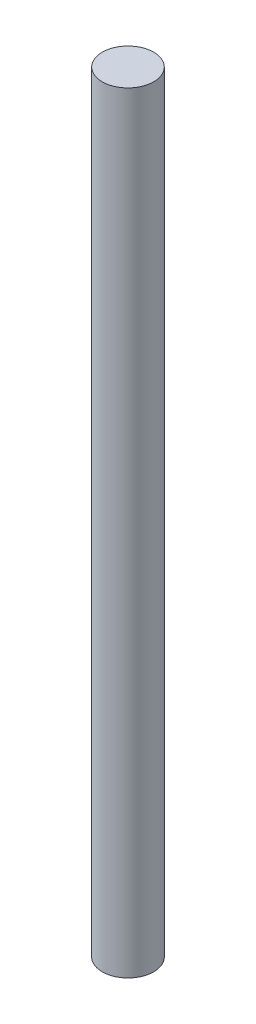
ISO-10303-21;
HEADER;
FILE_DESCRIPTION(('STEP AP214'),'2;1');
FILE_NAME('part.step','',(''),(''),'','','');
FILE_SCHEMA(('AUTOMOTIVE_DESIGN { 1 0 10303 214 1 1 1 1 }'));
ENDSEC;
DATA;
#1=APPLICATION_CONTEXT('core data for automotive mechanical design processes');
#2=APPLICATION_PROTOCOL_DEFINITION('international standard','automotive_design',2000,#1);
#3=PRODUCT_CONTEXT('',#1,'mechanical');
#4=PRODUCT('Part','Part','',(#3));
#5=PRODUCT_RELATED_PRODUCT_CATEGORY('part','',(#4));
#6=PRODUCT_DEFINITION_FORMATION('','',#4);
#7=PRODUCT_DEFINITION_CONTEXT('part definition',#1,'design');
#8=PRODUCT_DEFINITION('design','',#6,#7);
#9=PRODUCT_DEFINITION_SHAPE('','',#8);
#10=(LENGTH_UNIT() NAMED_UNIT(*) SI_UNIT(.MILLI.,.METRE.));
#11=(NAMED_UNIT(*) PLANE_ANGLE_UNIT() SI_UNIT($,.RADIAN.));
#12=(NAMED_UNIT(*) SI_UNIT($,.STERADIAN.) SOLID_ANGLE_UNIT());
#13=UNCERTAINTY_MEASURE_WITH_UNIT(LENGTH_MEASURE(1.E-05),#10,'distance_accuracy_value','');
#14=(GEOMETRIC_REPRESENTATION_CONTEXT(3) GLOBAL_UNCERTAINTY_ASSIGNED_CONTEXT((#13)) GLOBAL_UNIT_ASSIGNED_CONTEXT((#10,
#11,#12)) REPRESENTATION_CONTEXT('',''));
#15=CARTESIAN_POINT('',(0.,0.,0.));
#16=DIRECTION('',(0.,0.,1.));
#17=DIRECTION('',(1.,0.,0.));
#18=AXIS2_PLACEMENT_3D('',#15,#16,#17);
#19=CARTESIAN_POINT('',(0.,150.,0.));
#20=DIRECTION('',(0.,-1.,0.));
#21=DIRECTION('',(0.,0.,-1.));
#22=AXIS2_PLACEMENT_3D('',#19,#20,#21);
#23=CYLINDRICAL_SURFACE('',#22,5.);
#24=CARTESIAN_POINT('',(0.,150.,0.));
#25=DIRECTION('',(0.,1.,0.));
#26=DIRECTION('',(0.,0.,1.));
#27=AXIS2_PLACEMENT_3D('',#24,#25,#26);
#28=CIRCLE('',#27,5.);
#29=CARTESIAN_POINT('',(0.,150.,5.));
#30=VERTEX_POINT('',#29);
#31=EDGE_CURVE('E10',#30,#30,#28,.T.);
#32=ORIENTED_EDGE('',*,*,#31,.F.);
#33=EDGE_LOOP('',(#32));
#34=FACE_BOUND('',#33,.T.);
#35=CARTESIAN_POINT('',(0.,0.,0.));
#36=DIRECTION('',(0.,1.,0.));
#37=DIRECTION('',(0.,0.,1.));
#38=AXIS2_PLACEMENT_3D('',#35,#36,#37);
#39=CIRCLE('',#38,5.);
#40=CARTESIAN_POINT('',(0.,0.,5.));
#41=VERTEX_POINT('',#40);
#42=EDGE_CURVE('E46',#41,#41,#39,.T.);
#43=ORIENTED_EDGE('',*,*,#42,.T.);
#44=EDGE_LOOP('',(#43));
#45=FACE_BOUND('',#44,.T.);
#46=ADVANCED_FACE('F43',(#34,#45),#23,.T.);
#47=CARTESIAN_POINT('',(0.,150.,0.));
#48=DIRECTION('',(0.,1.,0.));
#49=DIRECTION('',(0.,0.,1.));
#50=AXIS2_PLACEMENT_3D('',#47,#48,#49);
#51=PLANE('',#50);
#52=ORIENTED_EDGE('',*,*,#31,.T.);
#53=EDGE_LOOP('',(#52));
#54=FACE_BOUND('',#53,.T.);
#55=ADVANCED_FACE('F58',(#54),#51,.T.);
#56=CARTESIAN_POINT('',(0.,0.,0.));
#57=DIRECTION('',(0.,1.,0.));
#58=DIRECTION('',(0.,0.,1.));
#59=AXIS2_PLACEMENT_3D('',#56,#57,#58);
#60=PLANE('',#59);
#61=ORIENTED_EDGE('',*,*,#42,.F.);
#62=EDGE_LOOP('',(#61));
#63=FACE_BOUND('',#62,.T.);
#64=ADVANCED_FACE('F59',(#63),#60,.F.);
#65=CLOSED_SHELL('',(#46,#55,#64));
#66=MANIFOLD_SOLID_BREP('B2',#65);
#67=ADVANCED_BREP_SHAPE_REPRESENTATION('',(#18,#66),#14);
#68=SHAPE_DEFINITION_REPRESENTATION(#9,#67);
ENDSEC;
END-ISO-10303-21;
